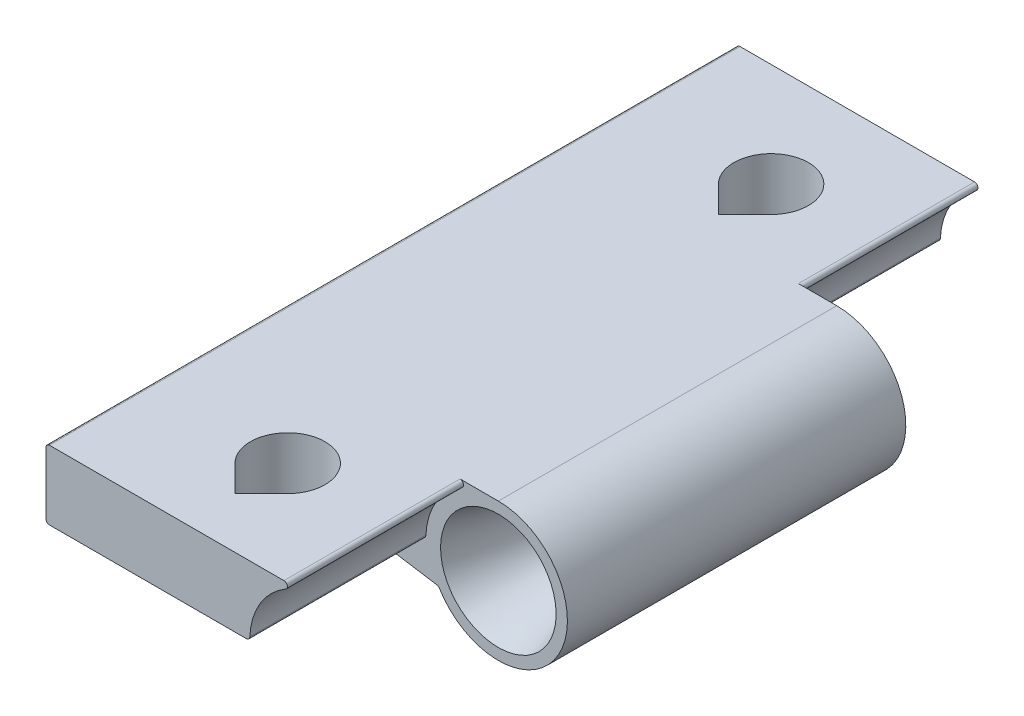
ISO-10303-21;
HEADER;
FILE_DESCRIPTION(('STEP AP214'),'2;1');
FILE_NAME('part.step','',(''),(''),'','','');
FILE_SCHEMA(('AUTOMOTIVE_DESIGN { 1 0 10303 214 1 1 1 1 }'));
ENDSEC;
DATA;
#1=APPLICATION_CONTEXT('core data for automotive mechanical design processes');
#2=APPLICATION_PROTOCOL_DEFINITION('international standard','automotive_design',2000,#1);
#3=PRODUCT_CONTEXT('',#1,'mechanical');
#4=PRODUCT('Part','Part','',(#3));
#5=PRODUCT_RELATED_PRODUCT_CATEGORY('part','',(#4));
#6=PRODUCT_DEFINITION_FORMATION('','',#4);
#7=PRODUCT_DEFINITION_CONTEXT('part definition',#1,'design');
#8=PRODUCT_DEFINITION('design','',#6,#7);
#9=PRODUCT_DEFINITION_SHAPE('','',#8);
#10=(LENGTH_UNIT() NAMED_UNIT(*) SI_UNIT(.MILLI.,.METRE.));
#11=(NAMED_UNIT(*) PLANE_ANGLE_UNIT() SI_UNIT($,.RADIAN.));
#12=(NAMED_UNIT(*) SI_UNIT($,.STERADIAN.) SOLID_ANGLE_UNIT());
#13=UNCERTAINTY_MEASURE_WITH_UNIT(LENGTH_MEASURE(1.E-05),#10,'distance_accuracy_value','');
#14=(GEOMETRIC_REPRESENTATION_CONTEXT(3) GLOBAL_UNCERTAINTY_ASSIGNED_CONTEXT((#13)) GLOBAL_UNIT_ASSIGNED_CONTEXT((#10,
#11,#12)) REPRESENTATION_CONTEXT('',''));
#15=CARTESIAN_POINT('',(0.,0.,0.));
#16=DIRECTION('',(0.,0.,1.));
#17=DIRECTION('',(1.,0.,0.));
#18=AXIS2_PLACEMENT_3D('',#15,#16,#17);
#19=CARTESIAN_POINT('',(-19.7500002980232,0.21327625264058,-25.));
#20=DIRECTION('',(0.,0.,1.));
#21=DIRECTION('',(1.,0.,0.));
#22=AXIS2_PLACEMENT_3D('',#19,#20,#21);
#23=CYLINDRICAL_SURFACE('',#22,0.25);
#24=CARTESIAN_POINT('',(-19.7500002980232,0.21327625264058,-12.25));
#25=DIRECTION('',(0.,0.,1.));
#26=DIRECTION('',(1.,0.,0.));
#27=AXIS2_PLACEMENT_3D('',#24,#25,#26);
#28=CIRCLE('',#27,0.25);
#29=CARTESIAN_POINT('',(-20.0000002980232,0.21327625264058,-12.25));
#30=VERTEX_POINT('',#29);
#31=CARTESIAN_POINT('',(-19.7893876267777,-0.0336015275130546,-12.25));
#32=VERTEX_POINT('',#31);
#33=EDGE_CURVE('E187',#30,#32,#28,.T.);
#34=ORIENTED_EDGE('',*,*,#33,.T.);
#35=DIRECTION('',(0.,0.,1.));
#36=VECTOR('',#35,1.);
#37=CARTESIAN_POINT('',(-19.7893876267777,-0.0336015275130518,-25.));
#38=LINE('',#37,#36);
#39=CARTESIAN_POINT('',(-19.7893876267777,-0.0336015275130638,12.25));
#40=VERTEX_POINT('',#39);
#41=EDGE_CURVE('E189',#40,#32,#38,.F.);
#42=ORIENTED_EDGE('',*,*,#41,.F.);
#43=CARTESIAN_POINT('',(-19.7500002980232,0.21327625264058,12.25));
#44=DIRECTION('',(0.,0.,1.));
#45=DIRECTION('',(1.,0.,0.));
#46=AXIS2_PLACEMENT_3D('',#43,#44,#45);
#47=CIRCLE('',#46,0.25);
#48=CARTESIAN_POINT('',(-20.0000002980232,0.21327625264058,12.25));
#49=VERTEX_POINT('',#48);
#50=EDGE_CURVE('E19',#40,#49,#47,.F.);
#51=ORIENTED_EDGE('',*,*,#50,.T.);
#52=DIRECTION('',(0.,0.,1.));
#53=VECTOR('',#52,1.);
#54=CARTESIAN_POINT('',(-20.0000002980232,0.21327625264058,-25.));
#55=LINE('',#54,#53);
#56=EDGE_CURVE('E442',#30,#49,#55,.T.);
#57=ORIENTED_EDGE('',*,*,#56,.F.);
#58=EDGE_LOOP('',(#34,#42,#51,#57));
#59=FACE_BOUND('',#58,.T.);
#60=ADVANCED_FACE('F16',(#59),#23,.T.);
#61=CARTESIAN_POINT('',(-19.7500002980232,0.25,-3.18750000000001));
#62=DIRECTION('',(0.,0.,1.));
#63=DIRECTION('',(1.,0.,0.));
#64=AXIS2_PLACEMENT_3D('',#61,#62,#63);
#65=CYLINDRICAL_SURFACE('',#64,0.25);
#66=CARTESIAN_POINT('',(-19.7500002980232,0.25,12.25));
#67=DIRECTION('',(0.,0.,1.));
#68=DIRECTION('',(1.,0.,0.));
#69=AXIS2_PLACEMENT_3D('',#66,#67,#68);
#70=CIRCLE('',#69,0.25);
#71=CARTESIAN_POINT('',(-20.0000002980232,0.25,12.25));
#72=VERTEX_POINT('',#71);
#73=CARTESIAN_POINT('',(-19.7500002980232,0.,12.25));
#74=VERTEX_POINT('',#73);
#75=EDGE_CURVE('E427',#72,#74,#70,.T.);
#76=ORIENTED_EDGE('',*,*,#75,.T.);
#77=DIRECTION('',(0.,0.,1.));
#78=VECTOR('',#77,1.);
#79=CARTESIAN_POINT('',(-19.7500002980232,0.,18.625));
#80=LINE('',#79,#78);
#81=CARTESIAN_POINT('',(-19.7500002980232,0.,25.));
#82=VERTEX_POINT('',#81);
#83=EDGE_CURVE('E416',#74,#82,#80,.T.);
#84=ORIENTED_EDGE('',*,*,#83,.T.);
#85=CARTESIAN_POINT('',(-19.7500002980232,0.25,25.));
#86=DIRECTION('',(0.,0.,1.));
#87=DIRECTION('',(1.,0.,0.));
#88=AXIS2_PLACEMENT_3D('',#85,#86,#87);
#89=CIRCLE('',#88,0.25);
#90=CARTESIAN_POINT('',(-20.0000002980232,0.25,25.));
#91=VERTEX_POINT('',#90);
#92=EDGE_CURVE('E423',#82,#91,#89,.F.);
#93=ORIENTED_EDGE('',*,*,#92,.T.);
#94=DIRECTION('',(0.,0.,1.));
#95=VECTOR('',#94,1.);
#96=CARTESIAN_POINT('',(-20.0000002980232,0.25,-25.));
#97=LINE('',#96,#95);
#98=EDGE_CURVE('E437',#72,#91,#97,.T.);
#99=ORIENTED_EDGE('',*,*,#98,.F.);
#100=EDGE_LOOP('',(#76,#84,#93,#99));
#101=FACE_BOUND('',#100,.T.);
#102=ADVANCED_FACE('F326',(#101),#65,.T.);
#103=CARTESIAN_POINT('',(-5.4943153185419,0.25,25.));
#104=DIRECTION('',(0.,0.,-1.));
#105=DIRECTION('',(-1.,0.,0.));
#106=AXIS2_PLACEMENT_3D('',#103,#104,#105);
#107=CYLINDRICAL_SURFACE('',#106,0.25);
#108=CARTESIAN_POINT('',(-5.49431531854189,0.25,12.25));
#109=DIRECTION('',(0.,0.,-1.));
#110=DIRECTION('',(-1.,0.,0.));
#111=AXIS2_PLACEMENT_3D('',#108,#109,#110);
#112=CIRCLE('',#111,0.25);
#113=CARTESIAN_POINT('',(-5.49431531854189,0.,12.25));
#114=VERTEX_POINT('',#113);
#115=CARTESIAN_POINT('',(-5.24457371653675,0.238636363790301,12.25));
#116=VERTEX_POINT('',#115);
#117=EDGE_CURVE('E501',#114,#116,#112,.F.);
#118=ORIENTED_EDGE('',*,*,#117,.T.);
#119=DIRECTION('',(0.,0.,-1.));
#120=VECTOR('',#119,1.);
#121=CARTESIAN_POINT('',(-5.24457371653676,0.238636363790301,25.));
#122=LINE('',#121,#120);
#123=CARTESIAN_POINT('',(-5.24457371653676,0.238636363790301,25.));
#124=VERTEX_POINT('',#123);
#125=EDGE_CURVE('E193',#116,#124,#122,.F.);
#126=ORIENTED_EDGE('',*,*,#125,.T.);
#127=CARTESIAN_POINT('',(-5.4943153185419,0.25,25.));
#128=DIRECTION('',(0.,0.,-1.));
#129=DIRECTION('',(-1.,0.,0.));
#130=AXIS2_PLACEMENT_3D('',#127,#128,#129);
#131=CIRCLE('',#130,0.25);
#132=CARTESIAN_POINT('',(-5.4943153185419,0.,25.));
#133=VERTEX_POINT('',#132);
#134=EDGE_CURVE('E420',#124,#133,#131,.T.);
#135=ORIENTED_EDGE('',*,*,#134,.T.);
#136=DIRECTION('',(0.,0.,1.));
#137=VECTOR('',#136,1.);
#138=CARTESIAN_POINT('',(-5.4943153185419,0.,18.625));
#139=LINE('',#138,#137);
#140=EDGE_CURVE('E292',#133,#114,#139,.F.);
#141=ORIENTED_EDGE('',*,*,#140,.T.);
#142=EDGE_LOOP('',(#118,#126,#135,#141));
#143=FACE_BOUND('',#142,.T.);
#144=ADVANCED_FACE('F323',(#143),#107,.T.);
#145=CARTESIAN_POINT('',(-19.7500002980232,0.25,-21.8125));
#146=DIRECTION('',(0.,0.,1.));
#147=DIRECTION('',(1.,0.,0.));
#148=AXIS2_PLACEMENT_3D('',#145,#146,#147);
#149=CYLINDRICAL_SURFACE('',#148,0.25);
#150=CARTESIAN_POINT('',(-19.7500002980232,0.25,-12.25));
#151=DIRECTION('',(0.,0.,1.));
#152=DIRECTION('',(1.,0.,0.));
#153=AXIS2_PLACEMENT_3D('',#150,#151,#152);
#154=CIRCLE('',#153,0.25);
#155=CARTESIAN_POINT('',(-19.7500002980232,0.,-12.25));
#156=VERTEX_POINT('',#155);
#157=CARTESIAN_POINT('',(-20.0000002980232,0.25,-12.25));
#158=VERTEX_POINT('',#157);
#159=EDGE_CURVE('E497',#156,#158,#154,.F.);
#160=ORIENTED_EDGE('',*,*,#159,.T.);
#161=DIRECTION('',(0.,0.,1.));
#162=VECTOR('',#161,1.);
#163=CARTESIAN_POINT('',(-20.0000002980232,0.25,-25.));
#164=LINE('',#163,#162);
#165=CARTESIAN_POINT('',(-20.0000002980232,0.25,-25.));
#166=VERTEX_POINT('',#165);
#167=EDGE_CURVE('E194',#166,#158,#164,.T.);
#168=ORIENTED_EDGE('',*,*,#167,.F.);
#169=CARTESIAN_POINT('',(-19.7500002980232,0.25,-25.));
#170=DIRECTION('',(0.,0.,1.));
#171=DIRECTION('',(1.,0.,0.));
#172=AXIS2_PLACEMENT_3D('',#169,#170,#171);
#173=CIRCLE('',#172,0.25);
#174=CARTESIAN_POINT('',(-19.7500002980232,0.,-25.));
#175=VERTEX_POINT('',#174);
#176=EDGE_CURVE('E499',#166,#175,#173,.T.);
#177=ORIENTED_EDGE('',*,*,#176,.T.);
#178=DIRECTION('',(0.,0.,1.));
#179=VECTOR('',#178,1.);
#180=CARTESIAN_POINT('',(-19.7500002980232,0.,-18.625));
#181=LINE('',#180,#179);
#182=EDGE_CURVE('E429',#175,#156,#181,.T.);
#183=ORIENTED_EDGE('',*,*,#182,.T.);
#184=EDGE_LOOP('',(#160,#168,#177,#183));
#185=FACE_BOUND('',#184,.T.);
#186=ADVANCED_FACE('F319',(#185),#149,.T.);
#187=CARTESIAN_POINT('',(-5.49431531854185,0.25,-25.));
#188=DIRECTION('',(0.,0.,1.));
#189=DIRECTION('',(1.,0.,0.));
#190=AXIS2_PLACEMENT_3D('',#187,#188,#189);
#191=CYLINDRICAL_SURFACE('',#190,0.25);
#192=CARTESIAN_POINT('',(-5.49431531854186,0.25,-12.25));
#193=DIRECTION('',(0.,0.,1.));
#194=DIRECTION('',(1.,0.,0.));
#195=AXIS2_PLACEMENT_3D('',#192,#193,#194);
#196=CIRCLE('',#195,0.25);
#197=CARTESIAN_POINT('',(-5.24457371653672,0.238636363790301,-12.25));
#198=VERTEX_POINT('',#197);
#199=CARTESIAN_POINT('',(-5.49431531854186,0.,-12.25));
#200=VERTEX_POINT('',#199);
#201=EDGE_CURVE('E443',#198,#200,#196,.F.);
#202=ORIENTED_EDGE('',*,*,#201,.T.);
#203=DIRECTION('',(0.,0.,1.));
#204=VECTOR('',#203,1.);
#205=CARTESIAN_POINT('',(-5.49431531854186,0.,-18.625));
#206=LINE('',#205,#204);
#207=CARTESIAN_POINT('',(-5.49431531854186,0.,-25.));
#208=VERTEX_POINT('',#207);
#209=EDGE_CURVE('E261',#200,#208,#206,.F.);
#210=ORIENTED_EDGE('',*,*,#209,.T.);
#211=CARTESIAN_POINT('',(-5.49431531854185,0.25,-25.));
#212=DIRECTION('',(0.,0.,1.));
#213=DIRECTION('',(1.,0.,0.));
#214=AXIS2_PLACEMENT_3D('',#211,#212,#213);
#215=CIRCLE('',#214,0.25);
#216=CARTESIAN_POINT('',(-5.24457371653671,0.238636363790301,-25.));
#217=VERTEX_POINT('',#216);
#218=EDGE_CURVE('E495',#208,#217,#215,.T.);
#219=ORIENTED_EDGE('',*,*,#218,.T.);
#220=DIRECTION('',(0.,0.,1.));
#221=VECTOR('',#220,1.);
#222=CARTESIAN_POINT('',(-5.24457371653672,0.238636363790301,-25.));
#223=LINE('',#222,#221);
#224=EDGE_CURVE('E439',#217,#198,#223,.T.);
#225=ORIENTED_EDGE('',*,*,#224,.T.);
#226=EDGE_LOOP('',(#202,#210,#219,#225));
#227=FACE_BOUND('',#226,.T.);
#228=ADVANCED_FACE('F315',(#227),#191,.T.);
#229=CARTESIAN_POINT('',(0.,0.,-25.));
#230=DIRECTION('',(0.,0.,1.));
#231=DIRECTION('',(1.,0.,0.));
#232=AXIS2_PLACEMENT_3D('',#229,#230,#231);
#233=CYLINDRICAL_SURFACE('',#232,5.2500000745058);
#234=CARTESIAN_POINT('',(0.,0.,-25.));
#235=DIRECTION('',(0.,0.,1.));
#236=DIRECTION('',(1.,0.,0.));
#237=AXIS2_PLACEMENT_3D('',#234,#235,#236);
#238=CIRCLE('',#237,5.2500000745058);
#239=CARTESIAN_POINT('',(-2.64660544545031,4.53409091201572,-25.));
#240=VERTEX_POINT('',#239);
#241=EDGE_CURVE('E482',#240,#217,#238,.T.);
#242=ORIENTED_EDGE('',*,*,#241,.F.);
#243=DIRECTION('',(0.,0.,-1.));
#244=VECTOR('',#243,1.);
#245=CARTESIAN_POINT('',(-2.64660544545031,4.53409091201572,-25.));
#246=LINE('',#245,#244);
#247=CARTESIAN_POINT('',(-2.64660544545032,4.53409091201572,-12.25));
#248=VERTEX_POINT('',#247);
#249=EDGE_CURVE('E243',#248,#240,#246,.T.);
#250=ORIENTED_EDGE('',*,*,#249,.F.);
#251=CARTESIAN_POINT('',(0.,0.,-12.25));
#252=DIRECTION('',(0.,0.,1.));
#253=DIRECTION('',(1.,0.,0.));
#254=AXIS2_PLACEMENT_3D('',#251,#252,#253);
#255=CIRCLE('',#254,5.2500000745058);
#256=EDGE_CURVE('E257',#198,#248,#255,.F.);
#257=ORIENTED_EDGE('',*,*,#256,.F.);
#258=ORIENTED_EDGE('',*,*,#224,.F.);
#259=EDGE_LOOP('',(#242,#250,#257,#258));
#260=FACE_BOUND('',#259,.T.);
#261=ADVANCED_FACE('F311',(#260),#233,.F.);
#262=CARTESIAN_POINT('',(-20.0000002980232,5.,-25.));
#263=DIRECTION('',(-1.,0.,0.));
#264=DIRECTION('',(0.,0.,1.));
#265=AXIS2_PLACEMENT_3D('',#262,#263,#264);
#266=PLANE('',#265);
#267=ORIENTED_EDGE('',*,*,#167,.T.);
#268=DIRECTION('',(0.,1.,0.));
#269=VECTOR('',#268,1.);
#270=CARTESIAN_POINT('',(-20.0000002980232,0.,-12.25));
#271=LINE('',#270,#269);
#272=EDGE_CURVE('E258',#30,#158,#271,.T.);
#273=ORIENTED_EDGE('',*,*,#272,.F.);
#274=ORIENTED_EDGE('',*,*,#56,.T.);
#275=DIRECTION('',(0.,1.,0.));
#276=VECTOR('',#275,1.);
#277=CARTESIAN_POINT('',(-20.0000002980232,5.,12.25));
#278=LINE('',#277,#276);
#279=EDGE_CURVE('E183',#49,#72,#278,.T.);
#280=ORIENTED_EDGE('',*,*,#279,.T.);
#281=ORIENTED_EDGE('',*,*,#98,.T.);
#282=DIRECTION('',(0.,1.,0.));
#283=VECTOR('',#282,1.);
#284=CARTESIAN_POINT('',(-20.0000002980232,0.,25.));
#285=LINE('',#284,#283);
#286=CARTESIAN_POINT('',(-20.0000002980232,4.75,25.));
#287=VERTEX_POINT('',#286);
#288=EDGE_CURVE('E224',#91,#287,#285,.T.);
#289=ORIENTED_EDGE('',*,*,#288,.T.);
#290=DIRECTION('',(0.,0.,1.));
#291=VECTOR('',#290,1.);
#292=CARTESIAN_POINT('',(-20.0000002980232,4.75,-25.));
#293=LINE('',#292,#291);
#294=CARTESIAN_POINT('',(-20.0000002980232,4.75,-25.));
#295=VERTEX_POINT('',#294);
#296=EDGE_CURVE('E433',#295,#287,#293,.T.);
#297=ORIENTED_EDGE('',*,*,#296,.F.);
#298=DIRECTION('',(0.,1.,0.));
#299=VECTOR('',#298,1.);
#300=CARTESIAN_POINT('',(-20.0000002980232,0.,-25.));
#301=LINE('',#300,#299);
#302=EDGE_CURVE('E237',#166,#295,#301,.T.);
#303=ORIENTED_EDGE('',*,*,#302,.F.);
#304=EDGE_LOOP('',(#267,#273,#274,#280,#281,#289,#297,#303));
#305=FACE_BOUND('',#304,.T.);
#306=ADVANCED_FACE('F308',(#305),#266,.T.);
#307=CARTESIAN_POINT('',(-20.0000002980232,0.,-25.));
#308=DIRECTION('',(-0.157549315017694,-0.987511120614576,0.));
#309=DIRECTION('',(0.987511120614576,-0.157549315017694,0.));
#310=AXIS2_PLACEMENT_3D('',#307,#308,#309);
#311=PLANE('',#310);
#312=ORIENTED_EDGE('',*,*,#41,.T.);
#313=DIRECTION('',(-0.987511120614576,0.157549315017695,0.));
#314=VECTOR('',#313,1.);
#315=CARTESIAN_POINT('',(-4.44596074148676,-2.48151967783954,-12.25));
#316=LINE('',#315,#314);
#317=CARTESIAN_POINT('',(-4.44596074148676,-2.48151967783954,-12.25));
#318=VERTEX_POINT('',#317);
#319=EDGE_CURVE('E250',#318,#32,#316,.T.);
#320=ORIENTED_EDGE('',*,*,#319,.F.);
#321=DIRECTION('',(0.,0.,-1.));
#322=VECTOR('',#321,1.);
#323=CARTESIAN_POINT('',(-4.44596074148676,-2.48151967783954,0.));
#324=LINE('',#323,#322);
#325=CARTESIAN_POINT('',(-4.44596074148676,-2.48151967783954,12.25));
#326=VERTEX_POINT('',#325);
#327=EDGE_CURVE('E197',#318,#326,#324,.F.);
#328=ORIENTED_EDGE('',*,*,#327,.T.);
#329=DIRECTION('',(0.987511120614576,-0.157549315017694,0.));
#330=VECTOR('',#329,1.);
#331=CARTESIAN_POINT('',(-19.7893876267777,-0.033601527513064,12.25));
#332=LINE('',#331,#330);
#333=EDGE_CURVE('E181',#40,#326,#332,.T.);
#334=ORIENTED_EDGE('',*,*,#333,.F.);
#335=EDGE_LOOP('',(#312,#320,#328,#334));
#336=FACE_BOUND('',#335,.T.);
#337=ADVANCED_FACE('F196',(#336),#311,.T.);
#338=CARTESIAN_POINT('',(0.,0.,25.));
#339=DIRECTION('',(0.,0.,-1.));
#340=DIRECTION('',(-1.,0.,0.));
#341=AXIS2_PLACEMENT_3D('',#338,#339,#340);
#342=CYLINDRICAL_SURFACE('',#341,5.2500000745058);
#343=CARTESIAN_POINT('',(0.,0.,25.));
#344=DIRECTION('',(0.,0.,-1.));
#345=DIRECTION('',(-1.,0.,0.));
#346=AXIS2_PLACEMENT_3D('',#343,#344,#345);
#347=CIRCLE('',#346,5.2500000745058);
#348=CARTESIAN_POINT('',(-2.64660544545035,4.53409091201573,25.));
#349=VERTEX_POINT('',#348);
#350=EDGE_CURVE('E230',#349,#124,#347,.F.);
#351=ORIENTED_EDGE('',*,*,#350,.T.);
#352=ORIENTED_EDGE('',*,*,#125,.F.);
#353=CARTESIAN_POINT('',(0.,0.,12.25));
#354=DIRECTION('',(0.,0.,-1.));
#355=DIRECTION('',(-1.,0.,0.));
#356=AXIS2_PLACEMENT_3D('',#353,#354,#355);
#357=CIRCLE('',#356,5.2500000745058);
#358=CARTESIAN_POINT('',(-2.64660544545034,4.53409091201573,12.25));
#359=VERTEX_POINT('',#358);
#360=EDGE_CURVE('E470',#359,#116,#357,.F.);
#361=ORIENTED_EDGE('',*,*,#360,.F.);
#362=DIRECTION('',(0.,0.,-1.));
#363=VECTOR('',#362,1.);
#364=CARTESIAN_POINT('',(-2.64660544545035,4.53409091201572,25.));
#365=LINE('',#364,#363);
#366=EDGE_CURVE('E200',#349,#359,#365,.T.);
#367=ORIENTED_EDGE('',*,*,#366,.F.);
#368=EDGE_LOOP('',(#351,#352,#361,#367));
#369=FACE_BOUND('',#368,.T.);
#370=ADVANCED_FACE('F300',(#369),#342,.F.);
#371=CARTESIAN_POINT('',(0.,0.,0.));
#372=DIRECTION('',(0.,0.,-1.));
#373=DIRECTION('',(-1.,0.,0.));
#374=AXIS2_PLACEMENT_3D('',#371,#372,#373);
#375=TOROIDAL_SURFACE('',#374,43.0625,40.7637648387709);
#376=CARTESIAN_POINT('',(0.,0.,12.25));
#377=DIRECTION('',(0.,0.,-1.));
#378=DIRECTION('',(-1.,0.,0.));
#379=AXIS2_PLACEMENT_3D('',#376,#377,#378);
#380=CIRCLE('',#379,4.18291636243241);
#381=CARTESIAN_POINT('',(-4.18291636243241,0.,12.25));
#382=VERTEX_POINT('',#381);
#383=EDGE_CURVE('E289',#382,#382,#380,.T.);
#384=ORIENTED_EDGE('',*,*,#383,.F.);
#385=EDGE_LOOP('',(#384));
#386=FACE_BOUND('',#385,.T.);
#387=CARTESIAN_POINT('',(0.,0.,-12.25));
#388=DIRECTION('',(0.,0.,-1.));
#389=DIRECTION('',(-1.,0.,0.));
#390=AXIS2_PLACEMENT_3D('',#387,#388,#389);
#391=CIRCLE('',#390,4.18291636243239);
#392=CARTESIAN_POINT('',(-4.18291636243239,0.,-12.25));
#393=VERTEX_POINT('',#392);
#394=EDGE_CURVE('E252',#393,#393,#391,.F.);
#395=ORIENTED_EDGE('',*,*,#394,.F.);
#396=EDGE_LOOP('',(#395));
#397=FACE_BOUND('',#396,.T.);
#398=ADVANCED_FACE('F295',(#386,#397),#375,.T.);
#399=CARTESIAN_POINT('',(-4.48534807024119,-2.72839745799318,0.));
#400=DIRECTION('',(0.,0.,-1.));
#401=DIRECTION('',(-1.,0.,0.));
#402=AXIS2_PLACEMENT_3D('',#399,#400,#401);
#403=CYLINDRICAL_SURFACE('',#402,0.25);
#404=ORIENTED_EDGE('',*,*,#327,.F.);
#405=CARTESIAN_POINT('',(-4.48534807024119,-2.72839745799318,-12.25));
#406=DIRECTION('',(0.,0.,-1.));
#407=DIRECTION('',(-1.,0.,0.));
#408=AXIS2_PLACEMENT_3D('',#405,#406,#407);
#409=CIRCLE('',#408,0.25);
#410=CARTESIAN_POINT('',(-4.27176006689637,-2.59847376951732,-12.25));
#411=VERTEX_POINT('',#410);
#412=EDGE_CURVE('E253',#411,#318,#409,.F.);
#413=ORIENTED_EDGE('',*,*,#412,.F.);
#414=DIRECTION('',(0.,0.,-1.));
#415=VECTOR('',#414,1.);
#416=CARTESIAN_POINT('',(-4.27176006689637,-2.59847376951732,0.));
#417=LINE('',#416,#415);
#418=CARTESIAN_POINT('',(-4.27176006689637,-2.59847376951732,12.25));
#419=VERTEX_POINT('',#418);
#420=EDGE_CURVE('E285',#419,#411,#417,.T.);
#421=ORIENTED_EDGE('',*,*,#420,.F.);
#422=CARTESIAN_POINT('',(-4.48534807024119,-2.72839745799318,12.25));
#423=DIRECTION('',(0.,0.,-1.));
#424=DIRECTION('',(-1.,0.,0.));
#425=AXIS2_PLACEMENT_3D('',#422,#423,#424);
#426=CIRCLE('',#425,0.25);
#427=EDGE_CURVE('E199',#326,#419,#426,.T.);
#428=ORIENTED_EDGE('',*,*,#427,.F.);
#429=EDGE_LOOP('',(#404,#413,#421,#428));
#430=FACE_BOUND('',#429,.T.);
#431=ADVANCED_FACE('F299',(#430),#403,.F.);
#432=CARTESIAN_POINT('',(-12.6250001862645,0.,18.625));
#433=DIRECTION('',(0.,1.,0.));
#434=DIRECTION('',(0.,0.,1.));
#435=AXIS2_PLACEMENT_3D('',#432,#433,#434);
#436=PLANE('',#435);
#437=DIRECTION('',(0.70710678118654,0.,-0.707106781186555));
#438=VECTOR('',#437,1.);
#439=CARTESIAN_POINT('',(-10.,0.,21.3183766184074));
#440=LINE('',#439,#438);
#441=CARTESIAN_POINT('',(-10.,0.,21.3183766184074));
#442=VERTEX_POINT('',#441);
#443=CARTESIAN_POINT('',(-8.09081169079631,0.,19.4091883092037));
#444=VERTEX_POINT('',#443);
#445=EDGE_CURVE('E273',#442,#444,#440,.T.);
#446=ORIENTED_EDGE('',*,*,#445,.T.);
#447=CARTESIAN_POINT('',(-10.,0.,17.5));
#448=DIRECTION('',(0.,1.,0.));
#449=DIRECTION('',(0.,0.,1.));
#450=AXIS2_PLACEMENT_3D('',#447,#448,#449);
#451=CIRCLE('',#450,2.7);
#452=CARTESIAN_POINT('',(-11.9091883092037,0.,19.4091883092037));
#453=VERTEX_POINT('',#452);
#454=EDGE_CURVE('E265',#444,#453,#451,.T.);
#455=ORIENTED_EDGE('',*,*,#454,.T.);
#456=DIRECTION('',(0.70710678118654,0.,0.707106781186555));
#457=VECTOR('',#456,1.);
#458=CARTESIAN_POINT('',(-11.9091883092037,0.,19.4091883092037));
#459=LINE('',#458,#457);
#460=EDGE_CURVE('E279',#453,#442,#459,.T.);
#461=ORIENTED_EDGE('',*,*,#460,.T.);
#462=EDGE_LOOP('',(#446,#455,#461));
#463=FACE_BOUND('',#462,.T.);
#464=DIRECTION('',(-1.,0.,0.));
#465=VECTOR('',#464,1.);
#466=CARTESIAN_POINT('',(-1.49011643024721E-07,0.,25.));
#467=LINE('',#466,#465);
#468=EDGE_CURVE('E227',#133,#82,#467,.T.);
#469=ORIENTED_EDGE('',*,*,#468,.T.);
#470=ORIENTED_EDGE('',*,*,#83,.F.);
#471=DIRECTION('',(1.,0.,0.));
#472=VECTOR('',#471,1.);
#473=CARTESIAN_POINT('',(-5.,0.,12.25));
#474=LINE('',#473,#472);
#475=EDGE_CURVE('E208',#114,#74,#474,.F.);
#476=ORIENTED_EDGE('',*,*,#475,.F.);
#477=ORIENTED_EDGE('',*,*,#140,.F.);
#478=EDGE_LOOP('',(#469,#470,#476,#477));
#479=FACE_BOUND('',#478,.T.);
#480=ADVANCED_FACE('F399',(#463,#479),#436,.F.);
#481=CARTESIAN_POINT('',(-12.6250001862645,0.,-18.625));
#482=DIRECTION('',(0.,1.,0.));
#483=DIRECTION('',(0.,0.,1.));
#484=AXIS2_PLACEMENT_3D('',#481,#482,#483);
#485=PLANE('',#484);
#486=DIRECTION('',(0.70710678118654,0.,-0.707106781186555));
#487=VECTOR('',#486,1.);
#488=CARTESIAN_POINT('',(-10.,0.,-13.6816233815926));
#489=LINE('',#488,#487);
#490=CARTESIAN_POINT('',(-10.,0.,-13.6816233815926));
#491=VERTEX_POINT('',#490);
#492=CARTESIAN_POINT('',(-8.09081169079631,0.,-15.5908116907963));
#493=VERTEX_POINT('',#492);
#494=EDGE_CURVE('E262',#491,#493,#489,.T.);
#495=ORIENTED_EDGE('',*,*,#494,.T.);
#496=CARTESIAN_POINT('',(-10.,0.,-17.5));
#497=DIRECTION('',(0.,1.,0.));
#498=DIRECTION('',(0.,0.,1.));
#499=AXIS2_PLACEMENT_3D('',#496,#497,#498);
#500=CIRCLE('',#499,2.7);
#501=CARTESIAN_POINT('',(-11.9091883092037,0.,-15.5908116907963));
#502=VERTEX_POINT('',#501);
#503=EDGE_CURVE('E249',#493,#502,#500,.T.);
#504=ORIENTED_EDGE('',*,*,#503,.T.);
#505=DIRECTION('',(0.70710678118654,0.,0.707106781186555));
#506=VECTOR('',#505,1.);
#507=CARTESIAN_POINT('',(-11.9091883092037,0.,-15.5908116907963));
#508=LINE('',#507,#506);
#509=EDGE_CURVE('E268',#502,#491,#508,.T.);
#510=ORIENTED_EDGE('',*,*,#509,.T.);
#511=EDGE_LOOP('',(#495,#504,#510));
#512=FACE_BOUND('',#511,.T.);
#513=DIRECTION('',(-1.,0.,0.));
#514=VECTOR('',#513,1.);
#515=CARTESIAN_POINT('',(-4.18291636243238,0.,-12.25));
#516=LINE('',#515,#514);
#517=EDGE_CURVE('E254',#156,#200,#516,.F.);
#518=ORIENTED_EDGE('',*,*,#517,.F.);
#519=ORIENTED_EDGE('',*,*,#182,.F.);
#520=DIRECTION('',(-1.,0.,0.));
#521=VECTOR('',#520,1.);
#522=CARTESIAN_POINT('',(-1.490115986158E-07,0.,-25.));
#523=LINE('',#522,#521);
#524=EDGE_CURVE('E240',#208,#175,#523,.T.);
#525=ORIENTED_EDGE('',*,*,#524,.F.);
#526=ORIENTED_EDGE('',*,*,#209,.F.);
#527=EDGE_LOOP('',(#518,#519,#525,#526));
#528=FACE_BOUND('',#527,.T.);
#529=ADVANCED_FACE('F396',(#512,#528),#485,.F.);
#530=CARTESIAN_POINT('',(-4.18291636243238,0.,-12.25));
#531=DIRECTION('',(0.,0.,-1.));
#532=DIRECTION('',(-1.,0.,0.));
#533=AXIS2_PLACEMENT_3D('',#530,#531,#532);
#534=PLANE('',#533);
#535=ORIENTED_EDGE('',*,*,#394,.T.);
#536=EDGE_LOOP('',(#535));
#537=FACE_BOUND('',#536,.T.);
#538=ORIENTED_EDGE('',*,*,#412,.T.);
#539=ORIENTED_EDGE('',*,*,#319,.T.);
#540=ORIENTED_EDGE('',*,*,#33,.F.);
#541=ORIENTED_EDGE('',*,*,#272,.T.);
#542=ORIENTED_EDGE('',*,*,#159,.F.);
#543=ORIENTED_EDGE('',*,*,#517,.T.);
#544=ORIENTED_EDGE('',*,*,#201,.F.);
#545=ORIENTED_EDGE('',*,*,#256,.T.);
#546=CARTESIAN_POINT('',(-2.7726342743975,4.75,-12.25));
#547=DIRECTION('',(0.,0.,-1.));
#548=DIRECTION('',(-1.,0.,0.));
#549=AXIS2_PLACEMENT_3D('',#546,#547,#548);
#550=CIRCLE('',#549,0.25);
#551=CARTESIAN_POINT('',(-2.7726342743975,5.,-12.25));
#552=VERTEX_POINT('',#551);
#553=EDGE_CURVE('E445',#552,#248,#550,.T.);
#554=ORIENTED_EDGE('',*,*,#553,.F.);
#555=DIRECTION('',(1.,0.,0.));
#556=VECTOR('',#555,1.);
#557=CARTESIAN_POINT('',(0.,5.,-12.25));
#558=LINE('',#557,#556);
#559=CARTESIAN_POINT('',(0.,5.,-12.25));
#560=VERTEX_POINT('',#559);
#561=EDGE_CURVE('E246',#560,#552,#558,.F.);
#562=ORIENTED_EDGE('',*,*,#561,.F.);
#563=CARTESIAN_POINT('',(0.,0.,-12.25));
#564=DIRECTION('',(0.,0.,-1.));
#565=DIRECTION('',(-1.,0.,0.));
#566=AXIS2_PLACEMENT_3D('',#563,#564,#565);
#567=CIRCLE('',#566,5.);
#568=EDGE_CURVE('E288',#411,#560,#567,.F.);
#569=ORIENTED_EDGE('',*,*,#568,.F.);
#570=EDGE_LOOP('',(#538,#539,#540,#541,#542,#543,#544,#545,#554,#562,#569));
#571=FACE_BOUND('',#570,.T.);
#572=ADVANCED_FACE('F392',(#537,#571),#534,.T.);
#573=CARTESIAN_POINT('',(-2.77263427439749,4.75,-25.));
#574=DIRECTION('',(0.,0.,-1.));
#575=DIRECTION('',(-1.,0.,0.));
#576=AXIS2_PLACEMENT_3D('',#573,#574,#575);
#577=CYLINDRICAL_SURFACE('',#576,0.25);
#578=ORIENTED_EDGE('',*,*,#553,.T.);
#579=ORIENTED_EDGE('',*,*,#249,.T.);
#580=CARTESIAN_POINT('',(-2.77263427439749,4.75,-25.));
#581=DIRECTION('',(0.,0.,-1.));
#582=DIRECTION('',(-1.,0.,0.));
#583=AXIS2_PLACEMENT_3D('',#580,#581,#582);
#584=CIRCLE('',#583,0.25);
#585=CARTESIAN_POINT('',(-2.77263427439749,5.,-25.));
#586=VERTEX_POINT('',#585);
#587=EDGE_CURVE('E239',#586,#240,#584,.T.);
#588=ORIENTED_EDGE('',*,*,#587,.F.);
#589=DIRECTION('',(0.,0.,1.));
#590=VECTOR('',#589,1.);
#591=CARTESIAN_POINT('',(-2.7726342743975,5.,-25.));
#592=LINE('',#591,#590);
#593=EDGE_CURVE('E236',#552,#586,#592,.F.);
#594=ORIENTED_EDGE('',*,*,#593,.F.);
#595=EDGE_LOOP('',(#578,#579,#588,#594));
#596=FACE_BOUND('',#595,.T.);
#597=ADVANCED_FACE('F388',(#596),#577,.T.);
#598=CARTESIAN_POINT('',(-1.490115986158E-07,0.,-25.));
#599=DIRECTION('',(0.,0.,-1.));
#600=DIRECTION('',(-1.,0.,0.));
#601=AXIS2_PLACEMENT_3D('',#598,#599,#600);
#602=PLANE('',#601);
#603=ORIENTED_EDGE('',*,*,#587,.T.);
#604=ORIENTED_EDGE('',*,*,#241,.T.);
#605=ORIENTED_EDGE('',*,*,#218,.F.);
#606=ORIENTED_EDGE('',*,*,#524,.T.);
#607=ORIENTED_EDGE('',*,*,#176,.F.);
#608=ORIENTED_EDGE('',*,*,#302,.T.);
#609=CARTESIAN_POINT('',(-19.7500002980232,4.75,-25.));
#610=DIRECTION('',(0.,0.,1.));
#611=DIRECTION('',(1.,0.,0.));
#612=AXIS2_PLACEMENT_3D('',#609,#610,#611);
#613=CIRCLE('',#612,0.25);
#614=CARTESIAN_POINT('',(-19.7500002980232,5.,-25.));
#615=VERTEX_POINT('',#614);
#616=EDGE_CURVE('E436',#615,#295,#613,.T.);
#617=ORIENTED_EDGE('',*,*,#616,.F.);
#618=DIRECTION('',(1.,0.,0.));
#619=VECTOR('',#618,1.);
#620=CARTESIAN_POINT('',(0.,5.,-25.));
#621=LINE('',#620,#619);
#622=EDGE_CURVE('E233',#586,#615,#621,.F.);
#623=ORIENTED_EDGE('',*,*,#622,.F.);
#624=EDGE_LOOP('',(#603,#604,#605,#606,#607,#608,#617,#623));
#625=FACE_BOUND('',#624,.T.);
#626=ADVANCED_FACE('F384',(#625),#602,.T.);
#627=CARTESIAN_POINT('',(-19.7500002980232,4.75,-25.));
#628=DIRECTION('',(0.,0.,1.));
#629=DIRECTION('',(1.,0.,0.));
#630=AXIS2_PLACEMENT_3D('',#627,#628,#629);
#631=CYLINDRICAL_SURFACE('',#630,0.25);
#632=ORIENTED_EDGE('',*,*,#616,.T.);
#633=ORIENTED_EDGE('',*,*,#296,.T.);
#634=CARTESIAN_POINT('',(-19.7500002980232,4.75,25.));
#635=DIRECTION('',(0.,0.,1.));
#636=DIRECTION('',(1.,0.,0.));
#637=AXIS2_PLACEMENT_3D('',#634,#635,#636);
#638=CIRCLE('',#637,0.25);
#639=CARTESIAN_POINT('',(-19.7500002980232,5.,25.));
#640=VERTEX_POINT('',#639);
#641=EDGE_CURVE('E226',#287,#640,#638,.F.);
#642=ORIENTED_EDGE('',*,*,#641,.T.);
#643=DIRECTION('',(0.,0.,1.));
#644=VECTOR('',#643,1.);
#645=CARTESIAN_POINT('',(-19.7500002980232,5.,-25.));
#646=LINE('',#645,#644);
#647=EDGE_CURVE('E223',#615,#640,#646,.T.);
#648=ORIENTED_EDGE('',*,*,#647,.F.);
#649=EDGE_LOOP('',(#632,#633,#642,#648));
#650=FACE_BOUND('',#649,.T.);
#651=ADVANCED_FACE('F380',(#650),#631,.T.);
#652=CARTESIAN_POINT('',(-1.49011643024721E-07,0.,25.));
#653=DIRECTION('',(0.,0.,-1.));
#654=DIRECTION('',(-1.,0.,0.));
#655=AXIS2_PLACEMENT_3D('',#652,#653,#654);
#656=PLANE('',#655);
#657=DIRECTION('',(1.,0.,0.));
#658=VECTOR('',#657,1.);
#659=CARTESIAN_POINT('',(0.,5.,25.));
#660=LINE('',#659,#658);
#661=CARTESIAN_POINT('',(-2.77263427439753,5.,25.));
#662=VERTEX_POINT('',#661);
#663=EDGE_CURVE('E214',#640,#662,#660,.T.);
#664=ORIENTED_EDGE('',*,*,#663,.F.);
#665=ORIENTED_EDGE('',*,*,#641,.F.);
#666=ORIENTED_EDGE('',*,*,#288,.F.);
#667=ORIENTED_EDGE('',*,*,#92,.F.);
#668=ORIENTED_EDGE('',*,*,#468,.F.);
#669=ORIENTED_EDGE('',*,*,#134,.F.);
#670=ORIENTED_EDGE('',*,*,#350,.F.);
#671=CARTESIAN_POINT('',(-2.77263427439753,4.75,25.));
#672=DIRECTION('',(0.,0.,-1.));
#673=DIRECTION('',(-1.,0.,0.));
#674=AXIS2_PLACEMENT_3D('',#671,#672,#673);
#675=CIRCLE('',#674,0.25);
#676=EDGE_CURVE('E204',#662,#349,#675,.T.);
#677=ORIENTED_EDGE('',*,*,#676,.F.);
#678=EDGE_LOOP('',(#664,#665,#666,#667,#668,#669,#670,#677));
#679=FACE_BOUND('',#678,.T.);
#680=ADVANCED_FACE('F376',(#679),#656,.F.);
#681=CARTESIAN_POINT('',(-2.77263427439753,4.75,25.));
#682=DIRECTION('',(0.,0.,-1.));
#683=DIRECTION('',(-1.,0.,0.));
#684=AXIS2_PLACEMENT_3D('',#681,#682,#683);
#685=CYLINDRICAL_SURFACE('',#684,0.25);
#686=CARTESIAN_POINT('',(-2.77263427439752,4.75,12.25));
#687=DIRECTION('',(0.,0.,-1.));
#688=DIRECTION('',(-1.,0.,0.));
#689=AXIS2_PLACEMENT_3D('',#686,#687,#688);
#690=CIRCLE('',#689,0.25);
#691=CARTESIAN_POINT('',(-2.77263427439752,5.,12.25));
#692=VERTEX_POINT('',#691);
#693=EDGE_CURVE('E202',#692,#359,#690,.T.);
#694=ORIENTED_EDGE('',*,*,#693,.F.);
#695=DIRECTION('',(0.,0.,1.));
#696=VECTOR('',#695,1.);
#697=CARTESIAN_POINT('',(-2.77263427439753,5.,-25.));
#698=LINE('',#697,#696);
#699=EDGE_CURVE('E210',#662,#692,#698,.F.);
#700=ORIENTED_EDGE('',*,*,#699,.F.);
#701=ORIENTED_EDGE('',*,*,#676,.T.);
#702=ORIENTED_EDGE('',*,*,#366,.T.);
#703=EDGE_LOOP('',(#694,#700,#701,#702));
#704=FACE_BOUND('',#703,.T.);
#705=ADVANCED_FACE('F372',(#704),#685,.T.);
#706=CARTESIAN_POINT('',(-5.,0.,12.25));
#707=DIRECTION('',(0.,0.,1.));
#708=DIRECTION('',(1.,0.,0.));
#709=AXIS2_PLACEMENT_3D('',#706,#707,#708);
#710=PLANE('',#709);
#711=ORIENTED_EDGE('',*,*,#383,.T.);
#712=EDGE_LOOP('',(#711));
#713=FACE_BOUND('',#712,.T.);
#714=ORIENTED_EDGE('',*,*,#75,.F.);
#715=ORIENTED_EDGE('',*,*,#279,.F.);
#716=ORIENTED_EDGE('',*,*,#50,.F.);
#717=ORIENTED_EDGE('',*,*,#333,.T.);
#718=ORIENTED_EDGE('',*,*,#427,.T.);
#719=CARTESIAN_POINT('',(0.,0.,12.25));
#720=DIRECTION('',(0.,0.,-1.));
#721=DIRECTION('',(-1.,0.,0.));
#722=AXIS2_PLACEMENT_3D('',#719,#720,#721);
#723=CIRCLE('',#722,5.);
#724=CARTESIAN_POINT('',(0.,5.,12.25));
#725=VERTEX_POINT('',#724);
#726=EDGE_CURVE('E276',#725,#419,#723,.T.);
#727=ORIENTED_EDGE('',*,*,#726,.F.);
#728=DIRECTION('',(1.,0.,0.));
#729=VECTOR('',#728,1.);
#730=CARTESIAN_POINT('',(0.,5.,12.25));
#731=LINE('',#730,#729);
#732=EDGE_CURVE('E213',#692,#725,#731,.T.);
#733=ORIENTED_EDGE('',*,*,#732,.F.);
#734=ORIENTED_EDGE('',*,*,#693,.T.);
#735=ORIENTED_EDGE('',*,*,#360,.T.);
#736=ORIENTED_EDGE('',*,*,#117,.F.);
#737=ORIENTED_EDGE('',*,*,#475,.T.);
#738=EDGE_LOOP('',(#714,#715,#716,#717,#718,#727,#733,#734,#735,#736,#737));
#739=FACE_BOUND('',#738,.T.);
#740=ADVANCED_FACE('F178',(#713,#739),#710,.T.);
#741=CARTESIAN_POINT('',(0.,0.,0.));
#742=DIRECTION('',(0.,0.,-1.));
#743=DIRECTION('',(-1.,0.,0.));
#744=AXIS2_PLACEMENT_3D('',#741,#742,#743);
#745=CYLINDRICAL_SURFACE('',#744,5.);
#746=DIRECTION('',(0.,0.,1.));
#747=VECTOR('',#746,1.);
#748=CARTESIAN_POINT('',(0.,5.,-25.));
#749=LINE('',#748,#747);
#750=EDGE_CURVE('E217',#725,#560,#749,.F.);
#751=ORIENTED_EDGE('',*,*,#750,.F.);
#752=ORIENTED_EDGE('',*,*,#726,.T.);
#753=ORIENTED_EDGE('',*,*,#420,.T.);
#754=ORIENTED_EDGE('',*,*,#568,.T.);
#755=EDGE_LOOP('',(#751,#752,#753,#754));
#756=FACE_BOUND('',#755,.T.);
#757=ADVANCED_FACE('F365',(#756),#745,.T.);
#758=CARTESIAN_POINT('',(-10.,0.,21.3183766184074));
#759=DIRECTION('',(0.707106781186555,0.,0.70710678118654));
#760=DIRECTION('',(0.70710678118654,0.,-0.707106781186555));
#761=AXIS2_PLACEMENT_3D('',#758,#759,#760);
#762=PLANE('',#761);
#763=DIRECTION('',(0.,1.,0.));
#764=VECTOR('',#763,1.);
#765=CARTESIAN_POINT('',(-10.,0.,21.3183766184074));
#766=LINE('',#765,#764);
#767=CARTESIAN_POINT('',(-10.,5.,21.3183766184074));
#768=VERTEX_POINT('',#767);
#769=EDGE_CURVE('E275',#442,#768,#766,.T.);
#770=ORIENTED_EDGE('',*,*,#769,.T.);
#771=DIRECTION('',(-0.707106781186547,0.,0.707106781186548));
#772=VECTOR('',#771,1.);
#773=CARTESIAN_POINT('',(-8.0908116907963,5.,19.4091883092037));
#774=LINE('',#773,#772);
#775=CARTESIAN_POINT('',(-8.09081169079631,5.,19.4091883092037));
#776=VERTEX_POINT('',#775);
#777=EDGE_CURVE('E220',#776,#768,#774,.T.);
#778=ORIENTED_EDGE('',*,*,#777,.F.);
#779=DIRECTION('',(0.,1.,0.));
#780=VECTOR('',#779,1.);
#781=CARTESIAN_POINT('',(-8.09081169079632,0.,19.4091883092037));
#782=LINE('',#781,#780);
#783=EDGE_CURVE('E463',#776,#444,#782,.F.);
#784=ORIENTED_EDGE('',*,*,#783,.T.);
#785=ORIENTED_EDGE('',*,*,#445,.F.);
#786=EDGE_LOOP('',(#770,#778,#784,#785));
#787=FACE_BOUND('',#786,.T.);
#788=ADVANCED_FACE('F361',(#787),#762,.F.);
#789=CARTESIAN_POINT('',(-11.9091883092037,0.,19.4091883092037));
#790=DIRECTION('',(-0.707106781186555,0.,0.70710678118654));
#791=DIRECTION('',(0.70710678118654,0.,0.707106781186555));
#792=AXIS2_PLACEMENT_3D('',#789,#790,#791);
#793=PLANE('',#792);
#794=DIRECTION('',(0.,1.,0.));
#795=VECTOR('',#794,1.);
#796=CARTESIAN_POINT('',(-11.9091883092037,0.,19.4091883092037));
#797=LINE('',#796,#795);
#798=CARTESIAN_POINT('',(-11.9091883092037,5.,19.4091883092037));
#799=VERTEX_POINT('',#798);
#800=EDGE_CURVE('E282',#453,#799,#797,.T.);
#801=ORIENTED_EDGE('',*,*,#800,.T.);
#802=DIRECTION('',(-0.707106781186547,0.,-0.707106781186548));
#803=VECTOR('',#802,1.);
#804=CARTESIAN_POINT('',(-10.,5.,21.3183766184074));
#805=LINE('',#804,#803);
#806=EDGE_CURVE('E458',#768,#799,#805,.T.);
#807=ORIENTED_EDGE('',*,*,#806,.F.);
#808=ORIENTED_EDGE('',*,*,#769,.F.);
#809=ORIENTED_EDGE('',*,*,#460,.F.);
#810=EDGE_LOOP('',(#801,#807,#808,#809));
#811=FACE_BOUND('',#810,.T.);
#812=ADVANCED_FACE('F357',(#811),#793,.F.);
#813=CARTESIAN_POINT('',(-10.,0.,17.5));
#814=DIRECTION('',(0.,1.,0.));
#815=DIRECTION('',(0.,0.,1.));
#816=AXIS2_PLACEMENT_3D('',#813,#814,#815);
#817=CYLINDRICAL_SURFACE('',#816,2.7);
#818=ORIENTED_EDGE('',*,*,#783,.F.);
#819=CARTESIAN_POINT('',(-10.,5.,17.5));
#820=DIRECTION('',(0.,1.,0.));
#821=DIRECTION('',(0.,0.,1.));
#822=AXIS2_PLACEMENT_3D('',#819,#820,#821);
#823=CIRCLE('',#822,2.7);
#824=EDGE_CURVE('E454',#799,#776,#823,.F.);
#825=ORIENTED_EDGE('',*,*,#824,.F.);
#826=ORIENTED_EDGE('',*,*,#800,.F.);
#827=ORIENTED_EDGE('',*,*,#454,.F.);
#828=EDGE_LOOP('',(#818,#825,#826,#827));
#829=FACE_BOUND('',#828,.T.);
#830=ADVANCED_FACE('F353',(#829),#817,.F.);
#831=CARTESIAN_POINT('',(-10.,0.,-13.6816233815926));
#832=DIRECTION('',(0.707106781186555,0.,0.70710678118654));
#833=DIRECTION('',(0.70710678118654,0.,-0.707106781186555));
#834=AXIS2_PLACEMENT_3D('',#831,#832,#833);
#835=PLANE('',#834);
#836=DIRECTION('',(0.,1.,0.));
#837=VECTOR('',#836,1.);
#838=CARTESIAN_POINT('',(-10.,0.,-13.6816233815926));
#839=LINE('',#838,#837);
#840=CARTESIAN_POINT('',(-10.,5.,-13.6816233815926));
#841=VERTEX_POINT('',#840);
#842=EDGE_CURVE('E264',#491,#841,#839,.T.);
#843=ORIENTED_EDGE('',*,*,#842,.T.);
#844=DIRECTION('',(-0.707106781186547,0.,0.707106781186548));
#845=VECTOR('',#844,1.);
#846=CARTESIAN_POINT('',(-8.0908116907963,5.,-15.5908116907963));
#847=LINE('',#846,#845);
#848=CARTESIAN_POINT('',(-8.09081169079631,5.,-15.5908116907963));
#849=VERTEX_POINT('',#848);
#850=EDGE_CURVE('E457',#849,#841,#847,.T.);
#851=ORIENTED_EDGE('',*,*,#850,.F.);
#852=DIRECTION('',(0.,1.,0.));
#853=VECTOR('',#852,1.);
#854=CARTESIAN_POINT('',(-8.09081169079632,0.,-15.5908116907963));
#855=LINE('',#854,#853);
#856=EDGE_CURVE('E461',#849,#493,#855,.F.);
#857=ORIENTED_EDGE('',*,*,#856,.T.);
#858=ORIENTED_EDGE('',*,*,#494,.F.);
#859=EDGE_LOOP('',(#843,#851,#857,#858));
#860=FACE_BOUND('',#859,.T.);
#861=ADVANCED_FACE('F350',(#860),#835,.F.);
#862=CARTESIAN_POINT('',(-11.9091883092037,0.,-15.5908116907963));
#863=DIRECTION('',(-0.707106781186555,0.,0.70710678118654));
#864=DIRECTION('',(0.70710678118654,0.,0.707106781186555));
#865=AXIS2_PLACEMENT_3D('',#862,#863,#864);
#866=PLANE('',#865);
#867=DIRECTION('',(0.,1.,0.));
#868=VECTOR('',#867,1.);
#869=CARTESIAN_POINT('',(-11.9091883092037,0.,-15.5908116907963));
#870=LINE('',#869,#868);
#871=CARTESIAN_POINT('',(-11.9091883092037,5.,-15.5908116907963));
#872=VERTEX_POINT('',#871);
#873=EDGE_CURVE('E34',#502,#872,#870,.T.);
#874=ORIENTED_EDGE('',*,*,#873,.T.);
#875=DIRECTION('',(-0.707106781186547,0.,-0.707106781186548));
#876=VECTOR('',#875,1.);
#877=CARTESIAN_POINT('',(-10.,5.,-13.6816233815926));
#878=LINE('',#877,#876);
#879=EDGE_CURVE('E25',#841,#872,#878,.T.);
#880=ORIENTED_EDGE('',*,*,#879,.F.);
#881=ORIENTED_EDGE('',*,*,#842,.F.);
#882=ORIENTED_EDGE('',*,*,#509,.F.);
#883=EDGE_LOOP('',(#874,#880,#881,#882));
#884=FACE_BOUND('',#883,.T.);
#885=ADVANCED_FACE('F342',(#884),#866,.F.);
#886=CARTESIAN_POINT('',(-10.,0.,-17.5));
#887=DIRECTION('',(0.,1.,0.));
#888=DIRECTION('',(0.,0.,1.));
#889=AXIS2_PLACEMENT_3D('',#886,#887,#888);
#890=CYLINDRICAL_SURFACE('',#889,2.7);
#891=ORIENTED_EDGE('',*,*,#856,.F.);
#892=CARTESIAN_POINT('',(-10.,5.,-17.5));
#893=DIRECTION('',(0.,1.,0.));
#894=DIRECTION('',(0.,0.,1.));
#895=AXIS2_PLACEMENT_3D('',#892,#893,#894);
#896=CIRCLE('',#895,2.7);
#897=EDGE_CURVE('E11',#872,#849,#896,.F.);
#898=ORIENTED_EDGE('',*,*,#897,.F.);
#899=ORIENTED_EDGE('',*,*,#873,.F.);
#900=ORIENTED_EDGE('',*,*,#503,.F.);
#901=EDGE_LOOP('',(#891,#898,#899,#900));
#902=FACE_BOUND('',#901,.T.);
#903=ADVANCED_FACE('F336',(#902),#890,.F.);
#904=CARTESIAN_POINT('',(0.,5.,-25.));
#905=DIRECTION('',(0.,1.,0.));
#906=DIRECTION('',(0.,0.,1.));
#907=AXIS2_PLACEMENT_3D('',#904,#905,#906);
#908=PLANE('',#907);
#909=ORIENTED_EDGE('',*,*,#879,.T.);
#910=ORIENTED_EDGE('',*,*,#897,.T.);
#911=ORIENTED_EDGE('',*,*,#850,.T.);
#912=EDGE_LOOP('',(#909,#910,#911));
#913=FACE_BOUND('',#912,.T.);
#914=ORIENTED_EDGE('',*,*,#806,.T.);
#915=ORIENTED_EDGE('',*,*,#824,.T.);
#916=ORIENTED_EDGE('',*,*,#777,.T.);
#917=EDGE_LOOP('',(#914,#915,#916));
#918=FACE_BOUND('',#917,.T.);
#919=ORIENTED_EDGE('',*,*,#732,.T.);
#920=ORIENTED_EDGE('',*,*,#750,.T.);
#921=ORIENTED_EDGE('',*,*,#561,.T.);
#922=ORIENTED_EDGE('',*,*,#593,.T.);
#923=ORIENTED_EDGE('',*,*,#622,.T.);
#924=ORIENTED_EDGE('',*,*,#647,.T.);
#925=ORIENTED_EDGE('',*,*,#663,.T.);
#926=ORIENTED_EDGE('',*,*,#699,.T.);
#927=EDGE_LOOP('',(#919,#920,#921,#922,#923,#924,#925,#926));
#928=FACE_BOUND('',#927,.T.);
#929=ADVANCED_FACE('F334',(#913,#918,#928),#908,.T.);
#930=CLOSED_SHELL('',(#60,#102,#144,#186,#228,#261,#306,#337,#370,#398,#431,#480,#529,#572,#597,
#626,#651,#680,#705,#740,#757,#788,#812,#830,#861,#885,#903,#929));
#931=MANIFOLD_SOLID_BREP('B1',#930);
#932=ADVANCED_BREP_SHAPE_REPRESENTATION('',(#18,#931),#14);
#933=SHAPE_DEFINITION_REPRESENTATION(#9,#932);
ENDSEC;
END-ISO-10303-21;
